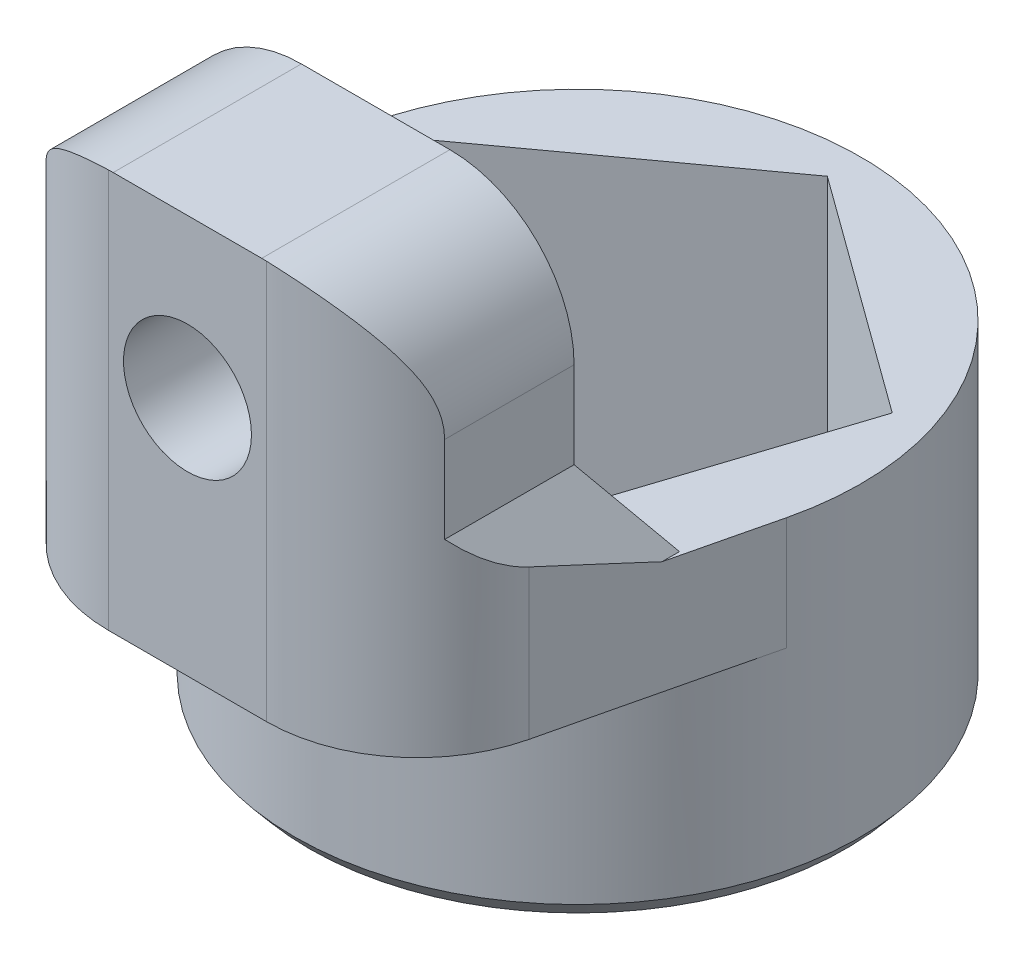
ISO-10303-21;
HEADER;
FILE_DESCRIPTION(('STEP AP214'),'2;1');
FILE_NAME('part.step','',(''),(''),'','','');
FILE_SCHEMA(('AUTOMOTIVE_DESIGN { 1 0 10303 214 1 1 1 1 }'));
ENDSEC;
DATA;
#1=APPLICATION_CONTEXT('core data for automotive mechanical design processes');
#2=APPLICATION_PROTOCOL_DEFINITION('international standard','automotive_design',2000,#1);
#3=PRODUCT_CONTEXT('',#1,'mechanical');
#4=PRODUCT('Part','Part','',(#3));
#5=PRODUCT_RELATED_PRODUCT_CATEGORY('part','',(#4));
#6=PRODUCT_DEFINITION_FORMATION('','',#4);
#7=PRODUCT_DEFINITION_CONTEXT('part definition',#1,'design');
#8=PRODUCT_DEFINITION('design','',#6,#7);
#9=PRODUCT_DEFINITION_SHAPE('','',#8);
#10=(LENGTH_UNIT() NAMED_UNIT(*) SI_UNIT(.MILLI.,.METRE.));
#11=(NAMED_UNIT(*) PLANE_ANGLE_UNIT() SI_UNIT($,.RADIAN.));
#12=(NAMED_UNIT(*) SI_UNIT($,.STERADIAN.) SOLID_ANGLE_UNIT());
#13=UNCERTAINTY_MEASURE_WITH_UNIT(LENGTH_MEASURE(1.E-05),#10,'distance_accuracy_value','');
#14=(GEOMETRIC_REPRESENTATION_CONTEXT(3) GLOBAL_UNCERTAINTY_ASSIGNED_CONTEXT((#13)) GLOBAL_UNIT_ASSIGNED_CONTEXT((#10,
#11,#12)) REPRESENTATION_CONTEXT('',''));
#15=CARTESIAN_POINT('',(0.,0.,0.));
#16=DIRECTION('',(0.,0.,1.));
#17=DIRECTION('',(1.,0.,0.));
#18=AXIS2_PLACEMENT_3D('',#15,#16,#17);
#19=CARTESIAN_POINT('',(0.,12.,0.367889489837582));
#20=DIRECTION('',(0.,0.,1.));
#21=DIRECTION('',(1.,0.,0.));
#22=AXIS2_PLACEMENT_3D('',#19,#20,#21);
#23=CYLINDRICAL_SURFACE('',#22,1.7);
#24=CARTESIAN_POINT('',(0.,12.,10.3678894898376));
#25=DIRECTION('',(0.,0.,1.));
#26=DIRECTION('',(1.,0.,0.));
#27=AXIS2_PLACEMENT_3D('',#24,#25,#26);
#28=CIRCLE('',#27,1.7);
#29=CARTESIAN_POINT('',(1.70000000000001,12.,10.3678894898376));
#30=VERTEX_POINT('',#29);
#31=EDGE_CURVE('E316',#30,#30,#28,.T.);
#32=ORIENTED_EDGE('',*,*,#31,.T.);
#33=EDGE_LOOP('',(#32));
#34=FACE_BOUND('',#33,.T.);
#35=CARTESIAN_POINT('',(0.,12.,7.76788948983758));
#36=DIRECTION('',(0.,0.,-1.));
#37=DIRECTION('',(-1.,0.,0.));
#38=AXIS2_PLACEMENT_3D('',#35,#36,#37);
#39=CIRCLE('',#38,1.7);
#40=CARTESIAN_POINT('',(-1.69999999999999,12.,7.76788948983758));
#41=VERTEX_POINT('',#40);
#42=EDGE_CURVE('E308',#41,#41,#39,.F.);
#43=ORIENTED_EDGE('',*,*,#42,.F.);
#44=EDGE_LOOP('',(#43));
#45=FACE_BOUND('',#44,.T.);
#46=ADVANCED_FACE('F82',(#34,#45),#23,.F.);
#47=CARTESIAN_POINT('',(0.,8.6,0.));
#48=DIRECTION('',(0.,1.,0.));
#49=DIRECTION('',(0.,0.,1.));
#50=AXIS2_PLACEMENT_3D('',#47,#48,#49);
#51=PLANE('',#50);
#52=DIRECTION('',(0.,0.,-1.));
#53=VECTOR('',#52,1.);
#54=CARTESIAN_POINT('',(-6.67406537056024,8.6,5.36788948983758));
#55=LINE('',#54,#53);
#56=CARTESIAN_POINT('',(-6.67406537056014,8.6,4.43371358860634));
#57=VERTEX_POINT('',#56);
#58=CARTESIAN_POINT('',(-6.67406537056024,8.6,3.96747441341814));
#59=VERTEX_POINT('',#58);
#60=EDGE_CURVE('E421',#57,#59,#55,.T.);
#61=ORIENTED_EDGE('',*,*,#60,.T.);
#62=DIRECTION('',(1.,0.,0.));
#63=VECTOR('',#62,1.);
#64=CARTESIAN_POINT('',(-3.9,8.6,3.96747441341814));
#65=LINE('',#64,#63);
#66=CARTESIAN_POINT('',(-4.35502244123018,8.6,3.96747441341814));
#67=VERTEX_POINT('',#66);
#68=EDGE_CURVE('E423',#59,#67,#65,.T.);
#69=ORIENTED_EDGE('',*,*,#68,.T.);
#70=DIRECTION('',(0.309016994374948,0.,0.951056516295153));
#71=VECTOR('',#70,1.);
#72=CARTESIAN_POINT('',(-6.31033255612459,8.6,-2.05035133726461));
#73=LINE('',#72,#71);
#74=CARTESIAN_POINT('',(-6.31033255612459,8.6,-2.05035133726461));
#75=VERTEX_POINT('',#74);
#76=EDGE_CURVE('E343',#75,#67,#73,.T.);
#77=ORIENTED_EDGE('',*,*,#76,.F.);
#78=DIRECTION('',(-0.809016994374947,0.,0.587785252292474));
#79=VECTOR('',#78,1.);
#80=CARTESIAN_POINT('',(0.,8.6,-6.63507630514591));
#81=LINE('',#80,#79);
#82=CARTESIAN_POINT('',(0.,8.6,-6.63507630514591));
#83=VERTEX_POINT('',#82);
#84=EDGE_CURVE('E340',#83,#75,#81,.T.);
#85=ORIENTED_EDGE('',*,*,#84,.F.);
#86=DIRECTION('',(-0.809016994374948,0.,-0.587785252292472));
#87=VECTOR('',#86,1.);
#88=CARTESIAN_POINT('',(6.31033255612459,8.6,-2.05035133726463));
#89=LINE('',#88,#87);
#90=CARTESIAN_POINT('',(6.31033255612459,8.6,-2.05035133726463));
#91=VERTEX_POINT('',#90);
#92=EDGE_CURVE('E338',#91,#83,#89,.T.);
#93=ORIENTED_EDGE('',*,*,#92,.F.);
#94=DIRECTION('',(0.309016994374946,0.,-0.951056516295154));
#95=VECTOR('',#94,1.);
#96=CARTESIAN_POINT('',(3.90000000000001,8.6,5.36788948983757));
#97=LINE('',#96,#95);
#98=CARTESIAN_POINT('',(4.35502244123019,8.6,3.96747441341813));
#99=VERTEX_POINT('',#98);
#100=EDGE_CURVE('E346',#99,#91,#97,.T.);
#101=ORIENTED_EDGE('',*,*,#100,.F.);
#102=DIRECTION('',(1.,0.,0.));
#103=VECTOR('',#102,1.);
#104=CARTESIAN_POINT('',(5.27365029414079,8.6,3.96747441341813));
#105=LINE('',#104,#103);
#106=CARTESIAN_POINT('',(6.67406537056024,8.6,3.96747441341812));
#107=VERTEX_POINT('',#106);
#108=EDGE_CURVE('E419',#99,#107,#105,.T.);
#109=ORIENTED_EDGE('',*,*,#108,.T.);
#110=DIRECTION('',(0.,0.,1.));
#111=VECTOR('',#110,1.);
#112=CARTESIAN_POINT('',(6.67406537056024,8.6,8.80711690189218));
#113=LINE('',#112,#111);
#114=CARTESIAN_POINT('',(6.67406537056014,8.6,4.43371358860711));
#115=VERTEX_POINT('',#114);
#116=EDGE_CURVE('E417',#107,#115,#113,.T.);
#117=ORIENTED_EDGE('',*,*,#116,.T.);
#118=CARTESIAN_POINT('',(1087.26790242018,8.6,262.577005832242));
#119=DIRECTION('',(0.,1.,0.));
#120=DIRECTION('',(0.,0.,1.));
#121=AXIS2_PLACEMENT_3D('',#118,#119,#120);
#122=CIRCLE('',#121,1111.);
#123=CARTESIAN_POINT('',(7.31471443705938,8.6,1.76651569601719));
#124=VERTEX_POINT('',#123);
#125=EDGE_CURVE('E389',#115,#124,#122,.F.);
#126=ORIENTED_EDGE('',*,*,#125,.T.);
#127=CARTESIAN_POINT('',(0.,8.6,0.));
#128=DIRECTION('',(0.,1.,0.));
#129=DIRECTION('',(0.,0.,1.));
#130=AXIS2_PLACEMENT_3D('',#127,#128,#129);
#131=CIRCLE('',#130,7.525);
#132=CARTESIAN_POINT('',(-7.31471443705938,8.6,1.76651569601719));
#133=VERTEX_POINT('',#132);
#134=EDGE_CURVE('E332',#124,#133,#131,.T.);
#135=ORIENTED_EDGE('',*,*,#134,.T.);
#136=CARTESIAN_POINT('',(-1087.26790242018,8.6,262.577005832242));
#137=DIRECTION('',(0.,1.,0.));
#138=DIRECTION('',(0.,0.,1.));
#139=AXIS2_PLACEMENT_3D('',#136,#137,#138);
#140=CIRCLE('',#139,1111.);
#141=EDGE_CURVE('E384',#133,#57,#140,.F.);
#142=ORIENTED_EDGE('',*,*,#141,.T.);
#143=EDGE_LOOP('',(#61,#69,#77,#85,#93,#101,#109,#117,#126,#135,#142));
#144=FACE_BOUND('',#143,.T.);
#145=ADVANCED_FACE('F521',(#144),#51,.T.);
#146=CARTESIAN_POINT('',(0.,0.,0.));
#147=DIRECTION('',(0.,1.,0.));
#148=DIRECTION('',(0.,0.,1.));
#149=AXIS2_PLACEMENT_3D('',#146,#147,#148);
#150=PLANE('',#149);
#151=CARTESIAN_POINT('',(0.,0.,0.));
#152=DIRECTION('',(0.,1.,0.));
#153=DIRECTION('',(0.,0.,1.));
#154=AXIS2_PLACEMENT_3D('',#151,#152,#153);
#155=CIRCLE('',#154,7.12499999999999);
#156=CARTESIAN_POINT('',(0.,0.,7.12499999999999));
#157=VERTEX_POINT('',#156);
#158=EDGE_CURVE('E452',#157,#157,#155,.F.);
#159=ORIENTED_EDGE('',*,*,#158,.T.);
#160=EDGE_LOOP('',(#159));
#161=FACE_BOUND('',#160,.T.);
#162=DIRECTION('',(-0.809016994374948,0.,-0.587785252292472));
#163=VECTOR('',#162,1.);
#164=CARTESIAN_POINT('',(6.31033255612459,0.,-2.05035133726463));
#165=LINE('',#164,#163);
#166=CARTESIAN_POINT('',(6.31033255612459,0.,-2.05035133726463));
#167=VERTEX_POINT('',#166);
#168=CARTESIAN_POINT('',(0.,0.,-6.63507630514591));
#169=VERTEX_POINT('',#168);
#170=EDGE_CURVE('E337',#167,#169,#165,.T.);
#171=ORIENTED_EDGE('',*,*,#170,.T.);
#172=DIRECTION('',(-0.809016994374947,0.,0.587785252292474));
#173=VECTOR('',#172,1.);
#174=CARTESIAN_POINT('',(0.,0.,-6.63507630514591));
#175=LINE('',#174,#173);
#176=CARTESIAN_POINT('',(-6.31033255612459,0.,-2.05035133726461));
#177=VERTEX_POINT('',#176);
#178=EDGE_CURVE('E351',#169,#177,#175,.T.);
#179=ORIENTED_EDGE('',*,*,#178,.T.);
#180=DIRECTION('',(0.309016994374948,0.,0.951056516295153));
#181=VECTOR('',#180,1.);
#182=CARTESIAN_POINT('',(-6.31033255612459,0.,-2.05035133726461));
#183=LINE('',#182,#181);
#184=CARTESIAN_POINT('',(-3.89999999999999,0.,5.36788948983758));
#185=VERTEX_POINT('',#184);
#186=EDGE_CURVE('E354',#177,#185,#183,.T.);
#187=ORIENTED_EDGE('',*,*,#186,.T.);
#188=DIRECTION('',(1.,0.,0.));
#189=VECTOR('',#188,1.);
#190=CARTESIAN_POINT('',(-3.89999999999999,0.,5.36788948983758));
#191=LINE('',#190,#189);
#192=CARTESIAN_POINT('',(3.90000000000001,0.,5.36788948983757));
#193=VERTEX_POINT('',#192);
#194=EDGE_CURVE('E357',#185,#193,#191,.T.);
#195=ORIENTED_EDGE('',*,*,#194,.T.);
#196=DIRECTION('',(0.309016994374946,0.,-0.951056516295154));
#197=VECTOR('',#196,1.);
#198=CARTESIAN_POINT('',(3.90000000000001,0.,5.36788948983757));
#199=LINE('',#198,#197);
#200=EDGE_CURVE('E341',#193,#167,#199,.T.);
#201=ORIENTED_EDGE('',*,*,#200,.T.);
#202=EDGE_LOOP('',(#171,#179,#187,#195,#201));
#203=FACE_BOUND('',#202,.T.);
#204=ADVANCED_FACE('F527',(#161,#203),#150,.F.);
#205=CARTESIAN_POINT('',(6.31033255612459,8.6,-2.05035133726463));
#206=DIRECTION('',(-0.587785252292472,0.,0.809016994374948));
#207=DIRECTION('',(0.809016994374948,0.,0.587785252292472));
#208=AXIS2_PLACEMENT_3D('',#205,#206,#207);
#209=PLANE('',#208);
#210=ORIENTED_EDGE('',*,*,#170,.F.);
#211=DIRECTION('',(0.,-1.,0.));
#212=VECTOR('',#211,1.);
#213=CARTESIAN_POINT('',(6.31033255612459,8.6,-2.05035133726463));
#214=LINE('',#213,#212);
#215=EDGE_CURVE('E348',#91,#167,#214,.T.);
#216=ORIENTED_EDGE('',*,*,#215,.F.);
#217=ORIENTED_EDGE('',*,*,#92,.T.);
#218=DIRECTION('',(0.,-1.,0.));
#219=VECTOR('',#218,1.);
#220=CARTESIAN_POINT('',(0.,8.6,-6.63507630514591));
#221=LINE('',#220,#219);
#222=EDGE_CURVE('E370',#83,#169,#221,.T.);
#223=ORIENTED_EDGE('',*,*,#222,.T.);
#224=EDGE_LOOP('',(#210,#216,#217,#223));
#225=FACE_BOUND('',#224,.T.);
#226=ADVANCED_FACE('F573',(#225),#209,.T.);
#227=CARTESIAN_POINT('',(0.,8.6,-6.63507630514591));
#228=DIRECTION('',(0.587785252292474,0.,0.809016994374947));
#229=DIRECTION('',(0.809016994374947,0.,-0.587785252292474));
#230=AXIS2_PLACEMENT_3D('',#227,#228,#229);
#231=PLANE('',#230);
#232=ORIENTED_EDGE('',*,*,#178,.F.);
#233=ORIENTED_EDGE('',*,*,#222,.F.);
#234=ORIENTED_EDGE('',*,*,#84,.T.);
#235=DIRECTION('',(0.,-1.,0.));
#236=VECTOR('',#235,1.);
#237=CARTESIAN_POINT('',(-6.31033255612459,8.6,-2.05035133726461));
#238=LINE('',#237,#236);
#239=EDGE_CURVE('E368',#75,#177,#238,.T.);
#240=ORIENTED_EDGE('',*,*,#239,.T.);
#241=EDGE_LOOP('',(#232,#233,#234,#240));
#242=FACE_BOUND('',#241,.T.);
#243=ADVANCED_FACE('F569',(#242),#231,.T.);
#244=CARTESIAN_POINT('',(-6.31033255612459,8.6,-2.05035133726461));
#245=DIRECTION('',(0.951056516295153,0.,-0.309016994374948));
#246=DIRECTION('',(-0.309016994374948,0.,-0.951056516295153));
#247=AXIS2_PLACEMENT_3D('',#244,#245,#246);
#248=PLANE('',#247);
#249=ORIENTED_EDGE('',*,*,#186,.F.);
#250=ORIENTED_EDGE('',*,*,#239,.F.);
#251=ORIENTED_EDGE('',*,*,#76,.T.);
#252=DIRECTION('',(-0.183211747775243,-0.8052866459945,-0.56386777994497));
#253=VECTOR('',#252,1.);
#254=CARTESIAN_POINT('',(-3.89999999999999,10.6,5.36788948983758));
#255=LINE('',#254,#253);
#256=CARTESIAN_POINT('',(-3.89999999999999,10.6,5.36788948983758));
#257=VERTEX_POINT('',#256);
#258=EDGE_CURVE('E429',#67,#257,#255,.F.);
#259=ORIENTED_EDGE('',*,*,#258,.T.);
#260=DIRECTION('',(0.,-1.,0.));
#261=VECTOR('',#260,1.);
#262=CARTESIAN_POINT('',(-3.89999999999999,8.6,5.36788948983758));
#263=LINE('',#262,#261);
#264=EDGE_CURVE('E366',#257,#185,#263,.T.);
#265=ORIENTED_EDGE('',*,*,#264,.T.);
#266=EDGE_LOOP('',(#249,#250,#251,#259,#265));
#267=FACE_BOUND('',#266,.T.);
#268=ADVANCED_FACE('F565',(#267),#248,.T.);
#269=CARTESIAN_POINT('',(-3.89999999999999,8.6,5.36788948983758));
#270=DIRECTION('',(0.,0.,-1.));
#271=DIRECTION('',(-1.,0.,0.));
#272=AXIS2_PLACEMENT_3D('',#269,#270,#271);
#273=PLANE('',#272);
#274=DIRECTION('',(-0.5,0.866025403784439,0.));
#275=VECTOR('',#274,1.);
#276=CARTESIAN_POINT('',(-1.64999999999999,9.14211616751135,5.36788948983758));
#277=LINE('',#276,#275);
#278=CARTESIAN_POINT('',(-1.64999999999999,9.14211616751135,5.36788948983758));
#279=VERTEX_POINT('',#278);
#280=CARTESIAN_POINT('',(-3.29999999999999,12.,5.36788948983758));
#281=VERTEX_POINT('',#280);
#282=EDGE_CURVE('E262',#279,#281,#277,.T.);
#283=ORIENTED_EDGE('',*,*,#282,.F.);
#284=DIRECTION('',(-1.,0.,0.));
#285=VECTOR('',#284,1.);
#286=CARTESIAN_POINT('',(1.65000000000001,9.14211616751135,5.36788948983758));
#287=LINE('',#286,#285);
#288=CARTESIAN_POINT('',(1.65000000000001,9.14211616751135,5.36788948983758));
#289=VERTEX_POINT('',#288);
#290=EDGE_CURVE('E281',#289,#279,#287,.T.);
#291=ORIENTED_EDGE('',*,*,#290,.F.);
#292=DIRECTION('',(-0.5,-0.866025403784439,0.));
#293=VECTOR('',#292,1.);
#294=CARTESIAN_POINT('',(3.30000000000001,12.,5.36788948983757));
#295=LINE('',#294,#293);
#296=CARTESIAN_POINT('',(3.30000000000001,12.,5.36788948983757));
#297=VERTEX_POINT('',#296);
#298=EDGE_CURVE('E284',#297,#289,#295,.T.);
#299=ORIENTED_EDGE('',*,*,#298,.F.);
#300=DIRECTION('',(0.5,-0.866025403784439,0.));
#301=VECTOR('',#300,1.);
#302=CARTESIAN_POINT('',(1.65000000000001,14.8578838324886,5.36788948983758));
#303=LINE('',#302,#301);
#304=CARTESIAN_POINT('',(1.65000000000001,14.8578838324886,5.36788948983758));
#305=VERTEX_POINT('',#304);
#306=EDGE_CURVE('E301',#305,#297,#303,.T.);
#307=ORIENTED_EDGE('',*,*,#306,.F.);
#308=DIRECTION('',(1.,0.,0.));
#309=VECTOR('',#308,1.);
#310=CARTESIAN_POINT('',(-1.64999999999999,14.8578838324886,5.36788948983758));
#311=LINE('',#310,#309);
#312=CARTESIAN_POINT('',(-1.64999999999999,14.8578838324886,5.36788948983758));
#313=VERTEX_POINT('',#312);
#314=EDGE_CURVE('E298',#313,#305,#311,.T.);
#315=ORIENTED_EDGE('',*,*,#314,.F.);
#316=DIRECTION('',(0.5,0.866025403784439,0.));
#317=VECTOR('',#316,1.);
#318=CARTESIAN_POINT('',(-3.29999999999999,12.,5.36788948983758));
#319=LINE('',#318,#317);
#320=EDGE_CURVE('E295',#281,#313,#319,.T.);
#321=ORIENTED_EDGE('',*,*,#320,.F.);
#322=EDGE_LOOP('',(#283,#291,#299,#307,#315,#321));
#323=FACE_BOUND('',#322,.T.);
#324=DIRECTION('',(-1.,0.,0.));
#325=VECTOR('',#324,1.);
#326=CARTESIAN_POINT('',(5.27365029414079,16.2,5.36788948983758));
#327=LINE('',#326,#325);
#328=CARTESIAN_POINT('',(1.97365029414079,16.2,5.36788948983758));
#329=VERTEX_POINT('',#328);
#330=CARTESIAN_POINT('',(-1.97365029414079,16.2,5.36788948983758));
#331=VERTEX_POINT('',#330);
#332=EDGE_CURVE('E322',#329,#331,#327,.T.);
#333=ORIENTED_EDGE('',*,*,#332,.F.);
#334=CARTESIAN_POINT('',(1.97365029414079,12.9,5.36788948983757));
#335=DIRECTION('',(0.,0.,-1.));
#336=DIRECTION('',(-1.,0.,0.));
#337=AXIS2_PLACEMENT_3D('',#334,#335,#336);
#338=CIRCLE('',#337,3.3);
#339=CARTESIAN_POINT('',(5.27365029414079,12.9,5.36788948983758));
#340=VERTEX_POINT('',#339);
#341=EDGE_CURVE('E463',#329,#340,#338,.T.);
#342=ORIENTED_EDGE('',*,*,#341,.T.);
#343=DIRECTION('',(0.,1.,0.));
#344=VECTOR('',#343,1.);
#345=CARTESIAN_POINT('',(5.27365029414079,5.6,5.36788948983758));
#346=LINE('',#345,#344);
#347=CARTESIAN_POINT('',(5.27365029414079,10.6,5.36788948983758));
#348=VERTEX_POINT('',#347);
#349=EDGE_CURVE('E328',#348,#340,#346,.T.);
#350=ORIENTED_EDGE('',*,*,#349,.F.);
#351=DIRECTION('',(-1.,0.,0.));
#352=VECTOR('',#351,1.);
#353=CARTESIAN_POINT('',(3.9,10.6,5.36788948983757));
#354=LINE('',#353,#352);
#355=CARTESIAN_POINT('',(3.90000000000001,10.6,5.36788948983757));
#356=VERTEX_POINT('',#355);
#357=EDGE_CURVE('E411',#348,#356,#354,.T.);
#358=ORIENTED_EDGE('',*,*,#357,.T.);
#359=DIRECTION('',(0.,-1.,0.));
#360=VECTOR('',#359,1.);
#361=CARTESIAN_POINT('',(3.90000000000001,8.6,5.36788948983757));
#362=LINE('',#361,#360);
#363=EDGE_CURVE('E364',#356,#193,#362,.T.);
#364=ORIENTED_EDGE('',*,*,#363,.T.);
#365=ORIENTED_EDGE('',*,*,#194,.F.);
#366=ORIENTED_EDGE('',*,*,#264,.F.);
#367=DIRECTION('',(-1.,0.,0.));
#368=VECTOR('',#367,1.);
#369=CARTESIAN_POINT('',(-5.27365029414079,10.6,5.36788948983758));
#370=LINE('',#369,#368);
#371=CARTESIAN_POINT('',(-5.27365029414079,10.6,5.36788948983758));
#372=VERTEX_POINT('',#371);
#373=EDGE_CURVE('E414',#257,#372,#370,.T.);
#374=ORIENTED_EDGE('',*,*,#373,.T.);
#375=DIRECTION('',(0.,1.,0.));
#376=VECTOR('',#375,1.);
#377=CARTESIAN_POINT('',(-5.27365029414079,5.6,5.36788948983758));
#378=LINE('',#377,#376);
#379=CARTESIAN_POINT('',(-5.27365029414079,12.9,5.36788948983758));
#380=VERTEX_POINT('',#379);
#381=EDGE_CURVE('E329',#372,#380,#378,.T.);
#382=ORIENTED_EDGE('',*,*,#381,.T.);
#383=CARTESIAN_POINT('',(-1.97365029414079,12.9,5.36788948983758));
#384=DIRECTION('',(0.,0.,-1.));
#385=DIRECTION('',(-1.,0.,0.));
#386=AXIS2_PLACEMENT_3D('',#383,#384,#385);
#387=CIRCLE('',#386,3.3);
#388=EDGE_CURVE('E461',#380,#331,#387,.T.);
#389=ORIENTED_EDGE('',*,*,#388,.T.);
#390=EDGE_LOOP('',(#333,#342,#350,#358,#364,#365,#366,#374,#382,#389));
#391=FACE_BOUND('',#390,.T.);
#392=ADVANCED_FACE('F561',(#323,#391),#273,.T.);
#393=CARTESIAN_POINT('',(3.90000000000001,8.6,5.36788948983757));
#394=DIRECTION('',(-0.951056516295154,0.,-0.309016994374946));
#395=DIRECTION('',(-0.309016994374946,0.,0.951056516295154));
#396=AXIS2_PLACEMENT_3D('',#393,#394,#395);
#397=PLANE('',#396);
#398=ORIENTED_EDGE('',*,*,#200,.F.);
#399=ORIENTED_EDGE('',*,*,#363,.F.);
#400=DIRECTION('',(-0.183211747775242,0.8052866459945,0.56386777994497));
#401=VECTOR('',#400,1.);
#402=CARTESIAN_POINT('',(3.6381809527217,11.7507961962072,6.17368566136491));
#403=LINE('',#402,#401);
#404=EDGE_CURVE('E437',#356,#99,#403,.F.);
#405=ORIENTED_EDGE('',*,*,#404,.T.);
#406=ORIENTED_EDGE('',*,*,#100,.T.);
#407=ORIENTED_EDGE('',*,*,#215,.T.);
#408=EDGE_LOOP('',(#398,#399,#405,#406,#407));
#409=FACE_BOUND('',#408,.T.);
#410=ADVANCED_FACE('F557',(#409),#397,.T.);
#411=CARTESIAN_POINT('',(0.,0.,0.));
#412=DIRECTION('',(0.,1.,0.));
#413=DIRECTION('',(0.,0.,1.));
#414=AXIS2_PLACEMENT_3D('',#411,#412,#413);
#415=CYLINDRICAL_SURFACE('',#414,7.525);
#416=CARTESIAN_POINT('',(0.,0.476701437037697,0.));
#417=DIRECTION('',(0.,1.,0.));
#418=DIRECTION('',(0.,0.,1.));
#419=AXIS2_PLACEMENT_3D('',#416,#417,#418);
#420=CIRCLE('',#419,7.525);
#421=CARTESIAN_POINT('',(0.,0.476701437037697,7.525));
#422=VERTEX_POINT('',#421);
#423=EDGE_CURVE('E445',#422,#422,#420,.T.);
#424=ORIENTED_EDGE('',*,*,#423,.T.);
#425=EDGE_LOOP('',(#424));
#426=FACE_BOUND('',#425,.T.);
#427=CARTESIAN_POINT('',(0.,5.6,0.));
#428=DIRECTION('',(0.,1.,0.));
#429=DIRECTION('',(0.,0.,1.));
#430=AXIS2_PLACEMENT_3D('',#427,#428,#429);
#431=CIRCLE('',#430,7.525);
#432=CARTESIAN_POINT('',(7.31471443705938,5.6,1.76651569601719));
#433=VERTEX_POINT('',#432);
#434=CARTESIAN_POINT('',(-7.31471443705938,5.6,1.76651569601719));
#435=VERTEX_POINT('',#434);
#436=EDGE_CURVE('E373',#433,#435,#431,.F.);
#437=ORIENTED_EDGE('',*,*,#436,.T.);
#438=DIRECTION('',(0.,1.,0.));
#439=VECTOR('',#438,1.);
#440=CARTESIAN_POINT('',(-7.31471443705938,0.,1.76651569601719));
#441=LINE('',#440,#439);
#442=EDGE_CURVE('E381',#435,#133,#441,.T.);
#443=ORIENTED_EDGE('',*,*,#442,.T.);
#444=ORIENTED_EDGE('',*,*,#134,.F.);
#445=DIRECTION('',(0.,1.,0.));
#446=VECTOR('',#445,1.);
#447=CARTESIAN_POINT('',(7.31471443705938,0.,1.76651569601719));
#448=LINE('',#447,#446);
#449=EDGE_CURVE('E376',#124,#433,#448,.F.);
#450=ORIENTED_EDGE('',*,*,#449,.T.);
#451=EDGE_LOOP('',(#437,#443,#444,#450));
#452=FACE_BOUND('',#451,.T.);
#453=ADVANCED_FACE('F553',(#426,#452),#415,.T.);
#454=CARTESIAN_POINT('',(-5.27365029414079,5.6,10.3678894898376));
#455=DIRECTION('',(-1.,0.,0.));
#456=DIRECTION('',(0.,0.,1.));
#457=AXIS2_PLACEMENT_3D('',#454,#455,#456);
#458=PLANE('',#457);
#459=DIRECTION('',(0.,-1.,0.));
#460=VECTOR('',#459,1.);
#461=CARTESIAN_POINT('',(-5.27365029414079,8.6,8.80711690189218));
#462=LINE('',#461,#460);
#463=CARTESIAN_POINT('',(-5.27365029414079,10.6,8.80711690189218));
#464=VERTEX_POINT('',#463);
#465=CARTESIAN_POINT('',(-5.27365029414079,12.9,8.80711690189218));
#466=VERTEX_POINT('',#465);
#467=EDGE_CURVE('E396',#464,#466,#462,.F.);
#468=ORIENTED_EDGE('',*,*,#467,.T.);
#469=DIRECTION('',(0.,0.,1.));
#470=VECTOR('',#469,1.);
#471=CARTESIAN_POINT('',(-5.27365029414079,12.9,10.3678894898376));
#472=LINE('',#471,#470);
#473=EDGE_CURVE('E12',#466,#380,#472,.F.);
#474=ORIENTED_EDGE('',*,*,#473,.T.);
#475=ORIENTED_EDGE('',*,*,#381,.F.);
#476=DIRECTION('',(0.,0.,1.));
#477=VECTOR('',#476,1.);
#478=CARTESIAN_POINT('',(-5.27365029414079,10.6,8.80711690189218));
#479=LINE('',#478,#477);
#480=EDGE_CURVE('E425',#372,#464,#479,.T.);
#481=ORIENTED_EDGE('',*,*,#480,.T.);
#482=EDGE_LOOP('',(#468,#474,#475,#481));
#483=FACE_BOUND('',#482,.T.);
#484=ADVANCED_FACE('F546',(#483),#458,.T.);
#485=CARTESIAN_POINT('',(5.27365029414079,5.6,10.3678894898376));
#486=DIRECTION('',(1.,0.,0.));
#487=DIRECTION('',(0.,0.,-1.));
#488=AXIS2_PLACEMENT_3D('',#485,#486,#487);
#489=PLANE('',#488);
#490=ORIENTED_EDGE('',*,*,#349,.T.);
#491=DIRECTION('',(0.,0.,-1.));
#492=VECTOR('',#491,1.);
#493=CARTESIAN_POINT('',(5.27365029414079,12.9,10.3678894898376));
#494=LINE('',#493,#492);
#495=CARTESIAN_POINT('',(5.27365029414079,12.9,8.80711690189218));
#496=VERTEX_POINT('',#495);
#497=EDGE_CURVE('E465',#340,#496,#494,.F.);
#498=ORIENTED_EDGE('',*,*,#497,.T.);
#499=DIRECTION('',(0.,-1.,0.));
#500=VECTOR('',#499,1.);
#501=CARTESIAN_POINT('',(5.27365029414079,16.2,8.80711690189218));
#502=LINE('',#501,#500);
#503=CARTESIAN_POINT('',(5.27365029414079,10.6,8.80711690189218));
#504=VERTEX_POINT('',#503);
#505=EDGE_CURVE('E407',#496,#504,#502,.T.);
#506=ORIENTED_EDGE('',*,*,#505,.T.);
#507=DIRECTION('',(0.,0.,-1.));
#508=VECTOR('',#507,1.);
#509=CARTESIAN_POINT('',(5.27365029414079,10.6,5.36788948983758));
#510=LINE('',#509,#508);
#511=EDGE_CURVE('E427',#504,#348,#510,.T.);
#512=ORIENTED_EDGE('',*,*,#511,.T.);
#513=EDGE_LOOP('',(#490,#498,#506,#512));
#514=FACE_BOUND('',#513,.T.);
#515=ADVANCED_FACE('F543',(#514),#489,.T.);
#516=CARTESIAN_POINT('',(5.27365029414079,5.6,10.3678894898376));
#517=DIRECTION('',(0.,0.,1.));
#518=DIRECTION('',(1.,0.,0.));
#519=AXIS2_PLACEMENT_3D('',#516,#517,#518);
#520=PLANE('',#519);
#521=ORIENTED_EDGE('',*,*,#31,.F.);
#522=EDGE_LOOP('',(#521));
#523=FACE_BOUND('',#522,.T.);
#524=DIRECTION('',(0.,1.,0.));
#525=VECTOR('',#524,1.);
#526=CARTESIAN_POINT('',(2.10345004300816,8.6,10.3678894898376));
#527=LINE('',#526,#525);
#528=CARTESIAN_POINT('',(2.10345004300816,5.6,10.3678894898376));
#529=VERTEX_POINT('',#528);
#530=CARTESIAN_POINT('',(2.10345004300816,16.1974462884472,10.3678894898376));
#531=VERTEX_POINT('',#530);
#532=EDGE_CURVE('E398',#529,#531,#527,.T.);
#533=ORIENTED_EDGE('',*,*,#532,.T.);
#534=CARTESIAN_POINT('',(1.97365029414079,12.9,10.3678894898376));
#535=DIRECTION('',(0.,0.,1.));
#536=DIRECTION('',(1.,0.,0.));
#537=AXIS2_PLACEMENT_3D('',#534,#535,#536);
#538=CIRCLE('',#537,3.3);
#539=CARTESIAN_POINT('',(1.97365029414079,16.2,10.3678894898376));
#540=VERTEX_POINT('',#539);
#541=EDGE_CURVE('E595',#531,#540,#538,.T.);
#542=ORIENTED_EDGE('',*,*,#541,.T.);
#543=DIRECTION('',(1.,0.,0.));
#544=VECTOR('',#543,1.);
#545=CARTESIAN_POINT('',(5.27365029414079,16.2,10.3678894898376));
#546=LINE('',#545,#544);
#547=CARTESIAN_POINT('',(-1.97365029414079,16.2,10.3678894898376));
#548=VERTEX_POINT('',#547);
#549=EDGE_CURVE('E319',#548,#540,#546,.T.);
#550=ORIENTED_EDGE('',*,*,#549,.F.);
#551=CARTESIAN_POINT('',(-1.97365029414079,12.9,10.3678894898376));
#552=DIRECTION('',(0.,0.,1.));
#553=DIRECTION('',(1.,0.,0.));
#554=AXIS2_PLACEMENT_3D('',#551,#552,#553);
#555=CIRCLE('',#554,3.3);
#556=CARTESIAN_POINT('',(-2.10345004300816,16.1974462884472,10.3678894898376));
#557=VERTEX_POINT('',#556);
#558=EDGE_CURVE('E105',#548,#557,#555,.T.);
#559=ORIENTED_EDGE('',*,*,#558,.T.);
#560=DIRECTION('',(0.,1.,0.));
#561=VECTOR('',#560,1.);
#562=CARTESIAN_POINT('',(-2.10345004300816,5.6,10.3678894898376));
#563=LINE('',#562,#561);
#564=CARTESIAN_POINT('',(-2.10345004300816,5.6,10.3678894898376));
#565=VERTEX_POINT('',#564);
#566=EDGE_CURVE('E401',#557,#565,#563,.F.);
#567=ORIENTED_EDGE('',*,*,#566,.T.);
#568=DIRECTION('',(1.,0.,0.));
#569=VECTOR('',#568,1.);
#570=CARTESIAN_POINT('',(5.27365029414079,5.6,10.3678894898376));
#571=LINE('',#570,#569);
#572=EDGE_CURVE('E325',#565,#529,#571,.T.);
#573=ORIENTED_EDGE('',*,*,#572,.T.);
#574=EDGE_LOOP('',(#533,#542,#550,#559,#567,#573));
#575=FACE_BOUND('',#574,.T.);
#576=ADVANCED_FACE('F541',(#523,#575),#520,.T.);
#577=CARTESIAN_POINT('',(0.,5.6,0.));
#578=DIRECTION('',(0.,1.,0.));
#579=DIRECTION('',(0.,0.,1.));
#580=AXIS2_PLACEMENT_3D('',#577,#578,#579);
#581=PLANE('',#580);
#582=ORIENTED_EDGE('',*,*,#572,.F.);
#583=CARTESIAN_POINT('',(-2.10345004300816,5.6,6.36788948983757));
#584=DIRECTION('',(0.,1.,0.));
#585=DIRECTION('',(0.,0.,1.));
#586=AXIS2_PLACEMENT_3D('',#583,#584,#585);
#587=CIRCLE('',#586,4.);
#588=CARTESIAN_POINT('',(-5.9964166883073,5.6,7.28702533321834));
#589=VERTEX_POINT('',#588);
#590=EDGE_CURVE('E405',#565,#589,#587,.F.);
#591=ORIENTED_EDGE('',*,*,#590,.T.);
#592=CARTESIAN_POINT('',(-1087.26790242018,5.6,262.577005832242));
#593=DIRECTION('',(0.,1.,0.));
#594=DIRECTION('',(0.,0.,1.));
#595=AXIS2_PLACEMENT_3D('',#592,#593,#594);
#596=CIRCLE('',#595,1111.);
#597=EDGE_CURVE('E387',#589,#435,#596,.T.);
#598=ORIENTED_EDGE('',*,*,#597,.T.);
#599=ORIENTED_EDGE('',*,*,#436,.F.);
#600=CARTESIAN_POINT('',(1087.26790242018,5.6,262.577005832242));
#601=DIRECTION('',(0.,1.,0.));
#602=DIRECTION('',(0.,0.,1.));
#603=AXIS2_PLACEMENT_3D('',#600,#601,#602);
#604=CIRCLE('',#603,1111.);
#605=CARTESIAN_POINT('',(5.99641668830753,5.6,7.2870253332184));
#606=VERTEX_POINT('',#605);
#607=EDGE_CURVE('E391',#433,#606,#604,.T.);
#608=ORIENTED_EDGE('',*,*,#607,.T.);
#609=CARTESIAN_POINT('',(2.10345004300816,5.6,6.36788948983757));
#610=DIRECTION('',(0.,1.,0.));
#611=DIRECTION('',(0.,0.,1.));
#612=AXIS2_PLACEMENT_3D('',#609,#610,#611);
#613=CIRCLE('',#612,4.);
#614=EDGE_CURVE('E403',#606,#529,#613,.F.);
#615=ORIENTED_EDGE('',*,*,#614,.T.);
#616=EDGE_LOOP('',(#582,#591,#598,#599,#608,#615));
#617=FACE_BOUND('',#616,.T.);
#618=ADVANCED_FACE('F537',(#617),#581,.F.);
#619=CARTESIAN_POINT('',(0.,16.2,0.));
#620=DIRECTION('',(0.,1.,0.));
#621=DIRECTION('',(0.,0.,1.));
#622=AXIS2_PLACEMENT_3D('',#619,#620,#621);
#623=PLANE('',#622);
#624=ORIENTED_EDGE('',*,*,#549,.T.);
#625=DIRECTION('',(0.,0.,-1.));
#626=VECTOR('',#625,1.);
#627=CARTESIAN_POINT('',(1.97365029414079,16.2,0.));
#628=LINE('',#627,#626);
#629=EDGE_CURVE('E458',#540,#329,#628,.T.);
#630=ORIENTED_EDGE('',*,*,#629,.T.);
#631=ORIENTED_EDGE('',*,*,#332,.T.);
#632=DIRECTION('',(0.,0.,1.));
#633=VECTOR('',#632,1.);
#634=CARTESIAN_POINT('',(-1.97365029414079,16.2,0.));
#635=LINE('',#634,#633);
#636=EDGE_CURVE('E455',#331,#548,#635,.T.);
#637=ORIENTED_EDGE('',*,*,#636,.T.);
#638=EDGE_LOOP('',(#624,#630,#631,#637));
#639=FACE_BOUND('',#638,.T.);
#640=ADVANCED_FACE('F534',(#639),#623,.T.);
#641=CARTESIAN_POINT('',(0.,0.,7.76788948983758));
#642=DIRECTION('',(0.,0.,-1.));
#643=DIRECTION('',(-1.,0.,0.));
#644=AXIS2_PLACEMENT_3D('',#641,#642,#643);
#645=PLANE('',#644);
#646=DIRECTION('',(-0.5,0.866025403784439,0.));
#647=VECTOR('',#646,1.);
#648=CARTESIAN_POINT('',(-1.64999999999999,9.14211616751135,7.76788948983758));
#649=LINE('',#648,#647);
#650=CARTESIAN_POINT('',(-1.64999999999999,9.14211616751135,7.76788948983758));
#651=VERTEX_POINT('',#650);
#652=CARTESIAN_POINT('',(-3.29999999999999,12.,7.76788948983758));
#653=VERTEX_POINT('',#652);
#654=EDGE_CURVE('E259',#651,#653,#649,.T.);
#655=ORIENTED_EDGE('',*,*,#654,.T.);
#656=DIRECTION('',(0.5,0.866025403784439,0.));
#657=VECTOR('',#656,1.);
#658=CARTESIAN_POINT('',(-3.29999999999999,12.,7.76788948983758));
#659=LINE('',#658,#657);
#660=CARTESIAN_POINT('',(-1.64999999999999,14.8578838324886,7.76788948983758));
#661=VERTEX_POINT('',#660);
#662=EDGE_CURVE('E270',#653,#661,#659,.T.);
#663=ORIENTED_EDGE('',*,*,#662,.T.);
#664=DIRECTION('',(1.,0.,0.));
#665=VECTOR('',#664,1.);
#666=CARTESIAN_POINT('',(-1.64999999999999,14.8578838324886,7.76788948983758));
#667=LINE('',#666,#665);
#668=CARTESIAN_POINT('',(1.65000000000001,14.8578838324886,7.76788948983758));
#669=VERTEX_POINT('',#668);
#670=EDGE_CURVE('E275',#661,#669,#667,.T.);
#671=ORIENTED_EDGE('',*,*,#670,.T.);
#672=DIRECTION('',(0.5,-0.866025403784439,0.));
#673=VECTOR('',#672,1.);
#674=CARTESIAN_POINT('',(1.65000000000001,14.8578838324886,7.76788948983758));
#675=LINE('',#674,#673);
#676=CARTESIAN_POINT('',(3.30000000000001,12.,7.76788948983757));
#677=VERTEX_POINT('',#676);
#678=EDGE_CURVE('E288',#669,#677,#675,.T.);
#679=ORIENTED_EDGE('',*,*,#678,.T.);
#680=DIRECTION('',(-0.5,-0.866025403784439,0.));
#681=VECTOR('',#680,1.);
#682=CARTESIAN_POINT('',(3.30000000000001,12.,7.76788948983757));
#683=LINE('',#682,#681);
#684=CARTESIAN_POINT('',(1.65000000000001,9.14211616751135,7.76788948983758));
#685=VERTEX_POINT('',#684);
#686=EDGE_CURVE('E291',#677,#685,#683,.T.);
#687=ORIENTED_EDGE('',*,*,#686,.T.);
#688=DIRECTION('',(-1.,0.,0.));
#689=VECTOR('',#688,1.);
#690=CARTESIAN_POINT('',(1.65000000000001,9.14211616751135,7.76788948983758));
#691=LINE('',#690,#689);
#692=EDGE_CURVE('E267',#685,#651,#691,.T.);
#693=ORIENTED_EDGE('',*,*,#692,.T.);
#694=EDGE_LOOP('',(#655,#663,#671,#679,#687,#693));
#695=FACE_BOUND('',#694,.T.);
#696=ORIENTED_EDGE('',*,*,#42,.T.);
#697=EDGE_LOOP('',(#696));
#698=FACE_BOUND('',#697,.T.);
#699=ADVANCED_FACE('F277',(#695,#698),#645,.T.);
#700=CARTESIAN_POINT('',(-1.64999999999999,9.14211616751135,7.76788948983758));
#701=DIRECTION('',(-0.866025403784439,-0.5,0.));
#702=DIRECTION('',(0.5,-0.866025403784439,0.));
#703=AXIS2_PLACEMENT_3D('',#700,#701,#702);
#704=PLANE('',#703);
#705=ORIENTED_EDGE('',*,*,#282,.T.);
#706=DIRECTION('',(0.,0.,-1.));
#707=VECTOR('',#706,1.);
#708=CARTESIAN_POINT('',(-3.29999999999999,12.,7.76788948983758));
#709=LINE('',#708,#707);
#710=EDGE_CURVE('E255',#653,#281,#709,.T.);
#711=ORIENTED_EDGE('',*,*,#710,.F.);
#712=ORIENTED_EDGE('',*,*,#654,.F.);
#713=DIRECTION('',(0.,0.,-1.));
#714=VECTOR('',#713,1.);
#715=CARTESIAN_POINT('',(-1.64999999999999,9.14211616751135,7.76788948983758));
#716=LINE('',#715,#714);
#717=EDGE_CURVE('E306',#651,#279,#716,.T.);
#718=ORIENTED_EDGE('',*,*,#717,.T.);
#719=EDGE_LOOP('',(#705,#711,#712,#718));
#720=FACE_BOUND('',#719,.T.);
#721=ADVANCED_FACE('F257',(#720),#704,.F.);
#722=CARTESIAN_POINT('',(1.65000000000001,9.14211616751135,7.76788948983758));
#723=DIRECTION('',(0.,-1.,0.));
#724=DIRECTION('',(0.,0.,-1.));
#725=AXIS2_PLACEMENT_3D('',#722,#723,#724);
#726=PLANE('',#725);
#727=ORIENTED_EDGE('',*,*,#290,.T.);
#728=ORIENTED_EDGE('',*,*,#717,.F.);
#729=ORIENTED_EDGE('',*,*,#692,.F.);
#730=DIRECTION('',(0.,0.,-1.));
#731=VECTOR('',#730,1.);
#732=CARTESIAN_POINT('',(1.65000000000001,9.14211616751135,7.76788948983758));
#733=LINE('',#732,#731);
#734=EDGE_CURVE('E309',#685,#289,#733,.T.);
#735=ORIENTED_EDGE('',*,*,#734,.T.);
#736=EDGE_LOOP('',(#727,#728,#729,#735));
#737=FACE_BOUND('',#736,.T.);
#738=ADVANCED_FACE('F725',(#737),#726,.F.);
#739=CARTESIAN_POINT('',(3.30000000000001,12.,7.76788948983757));
#740=DIRECTION('',(0.866025403784439,-0.5,0.));
#741=DIRECTION('',(0.5,0.866025403784439,0.));
#742=AXIS2_PLACEMENT_3D('',#739,#740,#741);
#743=PLANE('',#742);
#744=ORIENTED_EDGE('',*,*,#298,.T.);
#745=ORIENTED_EDGE('',*,*,#734,.F.);
#746=ORIENTED_EDGE('',*,*,#686,.F.);
#747=DIRECTION('',(0.,0.,-1.));
#748=VECTOR('',#747,1.);
#749=CARTESIAN_POINT('',(3.30000000000001,12.,7.76788948983757));
#750=LINE('',#749,#748);
#751=EDGE_CURVE('E311',#677,#297,#750,.T.);
#752=ORIENTED_EDGE('',*,*,#751,.T.);
#753=EDGE_LOOP('',(#744,#745,#746,#752));
#754=FACE_BOUND('',#753,.T.);
#755=ADVANCED_FACE('F715',(#754),#743,.F.);
#756=CARTESIAN_POINT('',(1.65000000000001,14.8578838324886,7.76788948983758));
#757=DIRECTION('',(0.866025403784439,0.5,0.));
#758=DIRECTION('',(-0.5,0.866025403784439,0.));
#759=AXIS2_PLACEMENT_3D('',#756,#757,#758);
#760=PLANE('',#759);
#761=ORIENTED_EDGE('',*,*,#306,.T.);
#762=ORIENTED_EDGE('',*,*,#751,.F.);
#763=ORIENTED_EDGE('',*,*,#678,.F.);
#764=DIRECTION('',(0.,0.,-1.));
#765=VECTOR('',#764,1.);
#766=CARTESIAN_POINT('',(1.65000000000001,14.8578838324886,7.76788948983758));
#767=LINE('',#766,#765);
#768=EDGE_CURVE('E313',#669,#305,#767,.T.);
#769=ORIENTED_EDGE('',*,*,#768,.T.);
#770=EDGE_LOOP('',(#761,#762,#763,#769));
#771=FACE_BOUND('',#770,.T.);
#772=ADVANCED_FACE('F705',(#771),#760,.F.);
#773=CARTESIAN_POINT('',(-1.64999999999999,14.8578838324886,7.76788948983758));
#774=DIRECTION('',(0.,1.,0.));
#775=DIRECTION('',(0.,0.,1.));
#776=AXIS2_PLACEMENT_3D('',#773,#774,#775);
#777=PLANE('',#776);
#778=ORIENTED_EDGE('',*,*,#314,.T.);
#779=ORIENTED_EDGE('',*,*,#768,.F.);
#780=ORIENTED_EDGE('',*,*,#670,.F.);
#781=DIRECTION('',(0.,0.,-1.));
#782=VECTOR('',#781,1.);
#783=CARTESIAN_POINT('',(-1.64999999999999,14.8578838324886,7.76788948983758));
#784=LINE('',#783,#782);
#785=EDGE_CURVE('E266',#661,#313,#784,.T.);
#786=ORIENTED_EDGE('',*,*,#785,.T.);
#787=EDGE_LOOP('',(#778,#779,#780,#786));
#788=FACE_BOUND('',#787,.T.);
#789=ADVANCED_FACE('F696',(#788),#777,.F.);
#790=CARTESIAN_POINT('',(-3.29999999999999,12.,7.76788948983758));
#791=DIRECTION('',(-0.866025403784439,0.5,0.));
#792=DIRECTION('',(-0.5,-0.866025403784439,0.));
#793=AXIS2_PLACEMENT_3D('',#790,#791,#792);
#794=PLANE('',#793);
#795=ORIENTED_EDGE('',*,*,#320,.T.);
#796=ORIENTED_EDGE('',*,*,#785,.F.);
#797=ORIENTED_EDGE('',*,*,#662,.F.);
#798=ORIENTED_EDGE('',*,*,#710,.T.);
#799=EDGE_LOOP('',(#795,#796,#797,#798));
#800=FACE_BOUND('',#799,.T.);
#801=ADVANCED_FACE('F271',(#800),#794,.F.);
#802=CARTESIAN_POINT('',(-1087.26790242018,5.6,262.577005832242));
#803=DIRECTION('',(0.,-1.,0.));
#804=DIRECTION('',(0.,0.,-1.));
#805=AXIS2_PLACEMENT_3D('',#802,#803,#804);
#806=CYLINDRICAL_SURFACE('',#805,1111.);
#807=ORIENTED_EDGE('',*,*,#597,.F.);
#808=DIRECTION('',(0.,-1.,0.));
#809=VECTOR('',#808,1.);
#810=CARTESIAN_POINT('',(-5.9964166883073,5.6,7.28702533321834));
#811=LINE('',#810,#809);
#812=CARTESIAN_POINT('',(-5.9964166883073,9.56778261483075,7.28702533321834));
#813=VERTEX_POINT('',#812);
#814=EDGE_CURVE('E394',#589,#813,#811,.F.);
#815=ORIENTED_EDGE('',*,*,#814,.T.);
#816=CARTESIAN_POINT('',(-1087.26790242018,-1534.64793448021,262.577005832242));
#817=DIRECTION('',(-0.819152044288988,0.573576436351051,0.));
#818=DIRECTION('',(-0.573576436351051,-0.819152044288988,0.));
#819=AXIS2_PLACEMENT_3D('',#816,#817,#818);
#820=ELLIPSE('',#819,1936.96938993502,1111.);
#821=EDGE_CURVE('E435',#813,#57,#820,.T.);
#822=ORIENTED_EDGE('',*,*,#821,.T.);
#823=ORIENTED_EDGE('',*,*,#141,.F.);
#824=ORIENTED_EDGE('',*,*,#442,.F.);
#825=EDGE_LOOP('',(#807,#815,#822,#823,#824));
#826=FACE_BOUND('',#825,.T.);
#827=ADVANCED_FACE('F581',(#826),#806,.F.);
#828=CARTESIAN_POINT('',(1087.26790242018,1.08416468150444E-13,262.577005832242));
#829=DIRECTION('',(0.,-1.,0.));
#830=DIRECTION('',(0.,0.,-1.));
#831=AXIS2_PLACEMENT_3D('',#828,#829,#830);
#832=CYLINDRICAL_SURFACE('',#831,1111.);
#833=ORIENTED_EDGE('',*,*,#125,.F.);
#834=CARTESIAN_POINT('',(1087.26790242018,-1534.64793448021,262.577005832242));
#835=DIRECTION('',(0.819152044288988,0.573576436351051,0.));
#836=DIRECTION('',(0.573576436351051,-0.819152044288988,0.));
#837=AXIS2_PLACEMENT_3D('',#834,#835,#836);
#838=ELLIPSE('',#837,1936.96938993502,1111.);
#839=CARTESIAN_POINT('',(5.9964166883073,9.56778261483061,7.28702533321834));
#840=VERTEX_POINT('',#839);
#841=EDGE_CURVE('E439',#115,#840,#838,.T.);
#842=ORIENTED_EDGE('',*,*,#841,.T.);
#843=DIRECTION('',(0.,-1.,0.));
#844=VECTOR('',#843,1.);
#845=CARTESIAN_POINT('',(5.9964166883073,1.08416468150444E-13,7.28702533321834));
#846=LINE('',#845,#844);
#847=EDGE_CURVE('E409',#840,#606,#846,.T.);
#848=ORIENTED_EDGE('',*,*,#847,.T.);
#849=ORIENTED_EDGE('',*,*,#607,.F.);
#850=ORIENTED_EDGE('',*,*,#449,.F.);
#851=EDGE_LOOP('',(#833,#842,#848,#849,#850));
#852=FACE_BOUND('',#851,.T.);
#853=ADVANCED_FACE('F584',(#852),#832,.F.);
#854=CARTESIAN_POINT('',(-2.10345004300816,5.6,6.36788948983757));
#855=DIRECTION('',(0.,-1.,0.));
#856=DIRECTION('',(0.,0.,-1.));
#857=AXIS2_PLACEMENT_3D('',#854,#855,#856);
#858=CYLINDRICAL_SURFACE('',#857,4.);
#859=ORIENTED_EDGE('',*,*,#566,.F.);
#860=CARTESIAN_POINT('',(-2.10345004300816,16.1974462884472,10.3678894898376));
#861=CARTESIAN_POINT('',(-2.18312110049636,16.1943281168555,10.3679082660297));
#862=CARTESIAN_POINT('',(-2.26266045203794,16.1882879361704,10.3655098187643));
#863=CARTESIAN_POINT('',(-2.42076465163517,16.1705321368484,10.3560642981012));
#864=CARTESIAN_POINT('',(-2.49933020243768,16.158820888798,10.3490208030456));
#865=CARTESIAN_POINT('',(-2.65431415978428,16.1299952552332,10.330540367101));
#866=CARTESIAN_POINT('',(-2.73074428496782,16.1129222505408,10.3191369333591));
#867=CARTESIAN_POINT('',(-2.88151610739442,16.0736189771829,10.2922348755886));
#868=CARTESIAN_POINT('',(-2.95585749345614,16.0513879445915,10.2767356449079));
#869=CARTESIAN_POINT('',(-3.17462145728621,15.9775404752773,10.2246950682761));
#870=CARTESIAN_POINT('',(-3.31535032264554,15.9186614292408,10.1825394026174));
#871=CARTESIAN_POINT('',(-3.58424226739279,15.7842168735911,10.0864598335842));
#872=CARTESIAN_POINT('',(-3.71238492577492,15.708624872796,10.0325172487382));
#873=CARTESIAN_POINT('',(-3.99783204269942,15.5138419294224,9.89554803595463));
#874=CARTESIAN_POINT('',(-4.14942028336245,15.3886868194964,9.80898274336468));
#875=CARTESIAN_POINT('',(-4.35707844516499,15.1844645243745,9.67365407353829));
#876=CARTESIAN_POINT('',(-4.42315967466569,15.1134311103862,9.62750097131995));
#877=CARTESIAN_POINT('',(-4.54862119893737,14.9661246928072,9.53446747790394));
#878=CARTESIAN_POINT('',(-4.60800429624495,14.8898539022156,9.48758740028607));
#879=CARTESIAN_POINT('',(-4.72097987798694,14.7308116185432,9.3934545048362));
#880=CARTESIAN_POINT('',(-4.77444963176437,14.6479481761714,9.34621004433576));
#881=CARTESIAN_POINT('',(-4.87419342848813,14.4769118235696,9.25364886366263));
#882=CARTESIAN_POINT('',(-4.92046525303026,14.388737288028,9.20833274091796));
#883=CARTESIAN_POINT('',(-5.00505504121616,14.2078481156726,9.12185266199868));
#884=CARTESIAN_POINT('',(-5.04344146369627,14.1151820181772,9.08065471562833));
#885=CARTESIAN_POINT('',(-5.11219905604013,13.9245758540464,9.00418841377719));
#886=CARTESIAN_POINT('',(-5.14257656933194,13.8266400357599,8.96891537358054));
#887=CARTESIAN_POINT('',(-5.18536671354123,13.6611786662281,8.91788558042324));
#888=CARTESIAN_POINT('',(-5.20033925241021,13.5950814839827,8.89962930906524));
#889=CARTESIAN_POINT('',(-5.22631516471465,13.4610928520523,8.86751688683911));
#890=CARTESIAN_POINT('',(-5.2373214521257,13.3932027591267,8.85365750650704));
#891=CARTESIAN_POINT('',(-5.25525800080162,13.2549277382517,8.83088246923026));
#892=CARTESIAN_POINT('',(-5.26212112332351,13.1845203407884,8.82204837070861));
#893=CARTESIAN_POINT('',(-5.27133417273274,13.0427575534746,8.81012713747689));
#894=CARTESIAN_POINT('',(-5.27367281316024,12.9714002388612,8.80705437518437));
#895=CARTESIAN_POINT('',(-5.27365029414081,12.9,8.8071169018923));
#896=B_SPLINE_CURVE_WITH_KNOTS('',3,(#860,#861,#862,#863,#864,#865,#866,#867,#868,#869,#870,
#871,#872,#873,#874,#875,#876,#877,#878,#879,#880,#881,#882,#883,#884,#885,#886,#887,#888,#889,
#890,#891,#892,#893,#894,#895),.UNSPECIFIED.,.F.,.F.,(4,2,2,2,2,2,2,2,2,2,2,2,2,2,2,2,2,4),(0.,
0.239080368243186,0.477976774216292,0.715072956156664,0.952204275489933,1.42474609684563,
1.8980423688706,2.5387406625064,2.86080723026423,3.18273853971981,3.51043452389501,
3.83823130483273,4.16304926129835,4.4876091686601,4.69793962733396,4.9081152412061,
5.1216111508884,5.33563894945948),.UNSPECIFIED.);
#897=EDGE_CURVE('E91',#557,#466,#896,.T.);
#898=ORIENTED_EDGE('',*,*,#897,.T.);
#899=ORIENTED_EDGE('',*,*,#467,.F.);
#900=CARTESIAN_POINT('',(-2.10345004300816,15.1275151696284,6.36788948983757));
#901=DIRECTION('',(-0.819152044288988,0.573576436351051,0.));
#902=DIRECTION('',(-0.573576436351051,-0.819152044288988,0.));
#903=AXIS2_PLACEMENT_3D('',#900,#901,#902);
#904=ELLIPSE('',#903,6.97378718248433,4.);
#905=EDGE_CURVE('E432',#464,#813,#904,.F.);
#906=ORIENTED_EDGE('',*,*,#905,.T.);
#907=ORIENTED_EDGE('',*,*,#814,.F.);
#908=ORIENTED_EDGE('',*,*,#590,.F.);
#909=EDGE_LOOP('',(#859,#898,#899,#906,#907,#908));
#910=FACE_BOUND('',#909,.T.);
#911=ADVANCED_FACE('F587',(#910),#858,.T.);
#912=CARTESIAN_POINT('',(2.10345004300816,1.08416468150444E-13,6.36788948983757));
#913=DIRECTION('',(0.,-1.,0.));
#914=DIRECTION('',(0.,0.,-1.));
#915=AXIS2_PLACEMENT_3D('',#912,#913,#914);
#916=CYLINDRICAL_SURFACE('',#915,4.);
#917=ORIENTED_EDGE('',*,*,#505,.F.);
#918=CARTESIAN_POINT('',(5.27365029414079,12.9,8.80711690189218));
#919=CARTESIAN_POINT('',(5.2736646899706,12.9635193914083,8.80707656812205));
#920=CARTESIAN_POINT('',(5.2718169415646,13.0270130959301,8.80949942601023));
#921=CARTESIAN_POINT('',(5.26451461865668,13.15334324833,8.8189574624942));
#922=CARTESIAN_POINT('',(5.25906612530119,13.216180623216,8.82598486449889));
#923=CARTESIAN_POINT('',(5.24477301422254,13.3399957464757,8.84422000219193));
#924=CARTESIAN_POINT('',(5.23597368050485,13.4009870638832,8.85537194249203));
#925=CARTESIAN_POINT('',(5.21515251957089,13.5216225815494,8.88137097039157));
#926=CARTESIAN_POINT('',(5.2031291039728,13.5812661020536,8.89621987908736));
#927=CARTESIAN_POINT('',(5.15293224357239,13.7993549673946,8.95708732964711));
#928=CARTESIAN_POINT('',(5.10511560820259,13.9529409684956,9.01309674172602));
#929=CARTESIAN_POINT('',(5.01899242703526,14.1736656300146,9.10676721301561));
#930=CARTESIAN_POINT('',(4.98772940861281,14.2459029893546,9.13975291062889));
#931=CARTESIAN_POINT('',(4.92060697717785,14.387125819438,9.20794411253013));
#932=CARTESIAN_POINT('',(4.88474916598871,14.4561124120449,9.24314884106302));
#933=CARTESIAN_POINT('',(4.79617228055727,14.6128682944667,9.32661496451583));
#934=CARTESIAN_POINT('',(4.74177032902593,14.6994168035291,9.37538675819994));
#935=CARTESIAN_POINT('',(4.62542123177882,14.8668521524445,9.47360675353051));
#936=CARTESIAN_POINT('',(4.563471625778,14.9477371325728,9.52305517104629));
#937=CARTESIAN_POINT('',(4.36670660733994,15.1813768745234,9.67006072104781));
#938=CARTESIAN_POINT('',(4.22065732432303,15.3256771552512,9.76659477442763));
#939=CARTESIAN_POINT('',(3.93284964055831,15.5605471492233,9.9280418987267));
#940=CARTESIAN_POINT('',(3.79644680918451,15.6560574870275,9.99536624224671));
#941=CARTESIAN_POINT('',(3.50640960419316,15.8272729840803,10.1170687943945));
#942=CARTESIAN_POINT('',(3.35279240430246,15.902997635339,10.1714597396633));
#943=CARTESIAN_POINT('',(3.05629242684468,16.0207574854308,10.2552936655961));
#944=CARTESIAN_POINT('',(2.91552461493035,16.0662190125234,10.2873156699504));
#945=CARTESIAN_POINT('',(2.69913737676115,16.1201257580323,10.3239644080993));
#946=CARTESIAN_POINT('',(2.62617901787125,16.1357089027066,10.334280618695));
#947=CARTESIAN_POINT('',(2.47894481001513,16.1619403153104,10.3509130643111));
#948=CARTESIAN_POINT('',(2.40466973686194,16.1725913950569,10.3572315792103));
#949=CARTESIAN_POINT('',(2.29239054482834,16.1847892538976,10.3636028815925));
#950=CARTESIAN_POINT('',(2.25466484123076,16.1882315881332,10.3652090142809));
#951=CARTESIAN_POINT('',(2.17911982578394,16.1938146926857,10.3673520299699));
#952=CARTESIAN_POINT('',(2.14130062299288,16.1959565851356,10.367889835728));
#953=CARTESIAN_POINT('',(2.10345004300816,16.1974462884472,10.3678894898376));
#954=B_SPLINE_CURVE_WITH_KNOTS('',3,(#918,#919,#920,#921,#922,#923,#924,#925,#926,#927,#928,
#929,#930,#931,#932,#933,#934,#935,#936,#937,#938,#939,#940,#941,#942,#943,#944,#945,#946,#947,
#948,#949,#950,#951,#952,#953),.UNSPECIFIED.,.F.,.F.,(4,2,2,2,2,2,2,2,2,2,2,2,2,2,2,2,2,4),(0.,
0.190443528117833,0.380566243317292,0.568205885653347,0.755938141248588,1.26363043405052,
1.51954919619112,1.77537898217121,2.11472945314422,2.45419083856554,3.13098433470127,
3.66785378516476,4.20419232348923,4.65612921868043,4.88183911753615,5.10742017812873,
5.22113744603449,5.33475644892192),.UNSPECIFIED.);
#955=EDGE_CURVE('E467',#496,#531,#954,.T.);
#956=ORIENTED_EDGE('',*,*,#955,.T.);
#957=ORIENTED_EDGE('',*,*,#532,.F.);
#958=ORIENTED_EDGE('',*,*,#614,.F.);
#959=ORIENTED_EDGE('',*,*,#847,.F.);
#960=CARTESIAN_POINT('',(2.10345004300816,15.1275151696284,6.36788948983757));
#961=DIRECTION('',(0.819152044288988,0.573576436351051,0.));
#962=DIRECTION('',(0.573576436351051,-0.819152044288988,0.));
#963=AXIS2_PLACEMENT_3D('',#960,#961,#962);
#964=ELLIPSE('',#963,6.97378718248433,4.);
#965=EDGE_CURVE('E442',#840,#504,#964,.F.);
#966=ORIENTED_EDGE('',*,*,#965,.T.);
#967=EDGE_LOOP('',(#917,#956,#957,#958,#959,#966));
#968=FACE_BOUND('',#967,.T.);
#969=ADVANCED_FACE('F475',(#968),#916,.T.);
#970=CARTESIAN_POINT('',(-5.27365029414079,10.6,10.3678894898376));
#971=DIRECTION('',(-0.819152044288988,0.573576436351051,0.));
#972=DIRECTION('',(0.,0.,-1.));
#973=AXIS2_PLACEMENT_3D('',#970,#971,#972);
#974=PLANE('',#973);
#975=ORIENTED_EDGE('',*,*,#905,.F.);
#976=ORIENTED_EDGE('',*,*,#480,.F.);
#977=DIRECTION('',(-0.497542812164526,-0.710564775461626,-0.497542812164526));
#978=VECTOR('',#977,1.);
#979=CARTESIAN_POINT('',(-4.03590604445787,12.3676819830412,6.60563373952051));
#980=LINE('',#979,#978);
#981=EDGE_CURVE('E296',#59,#372,#980,.F.);
#982=ORIENTED_EDGE('',*,*,#981,.F.);
#983=ORIENTED_EDGE('',*,*,#60,.F.);
#984=ORIENTED_EDGE('',*,*,#821,.F.);
#985=EDGE_LOOP('',(#975,#976,#982,#983,#984));
#986=FACE_BOUND('',#985,.T.);
#987=ADVANCED_FACE('F508',(#986),#974,.T.);
#988=CARTESIAN_POINT('',(-3.89999999999999,10.6,5.36788948983758));
#989=DIRECTION('',(0.,0.573576436351051,-0.819152044288988));
#990=DIRECTION('',(1.,0.,0.));
#991=AXIS2_PLACEMENT_3D('',#988,#989,#990);
#992=PLANE('',#991);
#993=ORIENTED_EDGE('',*,*,#258,.F.);
#994=ORIENTED_EDGE('',*,*,#68,.F.);
#995=ORIENTED_EDGE('',*,*,#981,.T.);
#996=ORIENTED_EDGE('',*,*,#373,.F.);
#997=EDGE_LOOP('',(#993,#994,#995,#996));
#998=FACE_BOUND('',#997,.T.);
#999=ADVANCED_FACE('F500',(#998),#992,.T.);
#1000=CARTESIAN_POINT('',(5.27365029414079,10.6,10.3678894898376));
#1001=DIRECTION('',(0.819152044288988,0.573576436351051,0.));
#1002=DIRECTION('',(0.,0.,1.));
#1003=AXIS2_PLACEMENT_3D('',#1000,#1001,#1002);
#1004=PLANE('',#1003);
#1005=ORIENTED_EDGE('',*,*,#841,.F.);
#1006=ORIENTED_EDGE('',*,*,#116,.F.);
#1007=DIRECTION('',(-0.497542812164526,0.710564775461625,0.497542812164526));
#1008=VECTOR('',#1007,1.);
#1009=CARTESIAN_POINT('',(4.03590604445786,12.3676819830412,6.6056337395205));
#1010=LINE('',#1009,#1008);
#1011=EDGE_CURVE('E447',#348,#107,#1010,.F.);
#1012=ORIENTED_EDGE('',*,*,#1011,.F.);
#1013=ORIENTED_EDGE('',*,*,#511,.F.);
#1014=ORIENTED_EDGE('',*,*,#965,.F.);
#1015=EDGE_LOOP('',(#1005,#1006,#1012,#1013,#1014));
#1016=FACE_BOUND('',#1015,.T.);
#1017=ADVANCED_FACE('F494',(#1016),#1004,.T.);
#1018=CARTESIAN_POINT('',(-3.89999999999999,10.6,5.36788948983758));
#1019=DIRECTION('',(0.,0.573576436351051,-0.819152044288988));
#1020=DIRECTION('',(1.,0.,0.));
#1021=AXIS2_PLACEMENT_3D('',#1018,#1019,#1020);
#1022=PLANE('',#1021);
#1023=ORIENTED_EDGE('',*,*,#1011,.T.);
#1024=ORIENTED_EDGE('',*,*,#108,.F.);
#1025=ORIENTED_EDGE('',*,*,#404,.F.);
#1026=ORIENTED_EDGE('',*,*,#357,.F.);
#1027=EDGE_LOOP('',(#1023,#1024,#1025,#1026));
#1028=FACE_BOUND('',#1027,.T.);
#1029=ADVANCED_FACE('F491',(#1028),#1022,.T.);
#1030=CARTESIAN_POINT('',(0.,0.476701437037697,0.));
#1031=DIRECTION('',(0.,1.,0.));
#1032=DIRECTION('',(0.,0.,1.));
#1033=AXIS2_PLACEMENT_3D('',#1030,#1031,#1032);
#1034=CONICAL_SURFACE('',#1033,7.525,0.698131700797734);
#1035=ORIENTED_EDGE('',*,*,#158,.F.);
#1036=EDGE_LOOP('',(#1035));
#1037=FACE_BOUND('',#1036,.T.);
#1038=ORIENTED_EDGE('',*,*,#423,.F.);
#1039=EDGE_LOOP('',(#1038));
#1040=FACE_BOUND('',#1039,.T.);
#1041=ADVANCED_FACE('F483',(#1037,#1040),#1034,.T.);
#1042=CARTESIAN_POINT('',(1.97365029414079,12.9,0.));
#1043=DIRECTION('',(0.,0.,-1.));
#1044=DIRECTION('',(-1.,0.,0.));
#1045=AXIS2_PLACEMENT_3D('',#1042,#1043,#1044);
#1046=CYLINDRICAL_SURFACE('',#1045,3.3);
#1047=ORIENTED_EDGE('',*,*,#955,.F.);
#1048=ORIENTED_EDGE('',*,*,#497,.F.);
#1049=ORIENTED_EDGE('',*,*,#341,.F.);
#1050=ORIENTED_EDGE('',*,*,#629,.F.);
#1051=ORIENTED_EDGE('',*,*,#541,.F.);
#1052=EDGE_LOOP('',(#1047,#1048,#1049,#1050,#1051));
#1053=FACE_BOUND('',#1052,.T.);
#1054=ADVANCED_FACE('F479',(#1053),#1046,.T.);
#1055=CARTESIAN_POINT('',(-1.97365029414079,12.9,0.));
#1056=DIRECTION('',(0.,0.,1.));
#1057=DIRECTION('',(1.,0.,0.));
#1058=AXIS2_PLACEMENT_3D('',#1055,#1056,#1057);
#1059=CYLINDRICAL_SURFACE('',#1058,3.3);
#1060=ORIENTED_EDGE('',*,*,#388,.F.);
#1061=ORIENTED_EDGE('',*,*,#473,.F.);
#1062=ORIENTED_EDGE('',*,*,#897,.F.);
#1063=ORIENTED_EDGE('',*,*,#558,.F.);
#1064=ORIENTED_EDGE('',*,*,#636,.F.);
#1065=EDGE_LOOP('',(#1060,#1061,#1062,#1063,#1064));
#1066=FACE_BOUND('',#1065,.T.);
#1067=ADVANCED_FACE('F84',(#1066),#1059,.T.);
#1068=CLOSED_SHELL('',(#46,#145,#204,#226,#243,#268,#392,#410,#453,#484,#515,#576,#618,#640,
#699,#721,#738,#755,#772,#789,#801,#827,#853,#911,#969,#987,#999,#1017,#1029,#1041,#1054,#1067));
#1069=MANIFOLD_SOLID_BREP('B2',#1068);
#1070=ADVANCED_BREP_SHAPE_REPRESENTATION('',(#18,#1069),#14);
#1071=SHAPE_DEFINITION_REPRESENTATION(#9,#1070);
ENDSEC;
END-ISO-10303-21;
